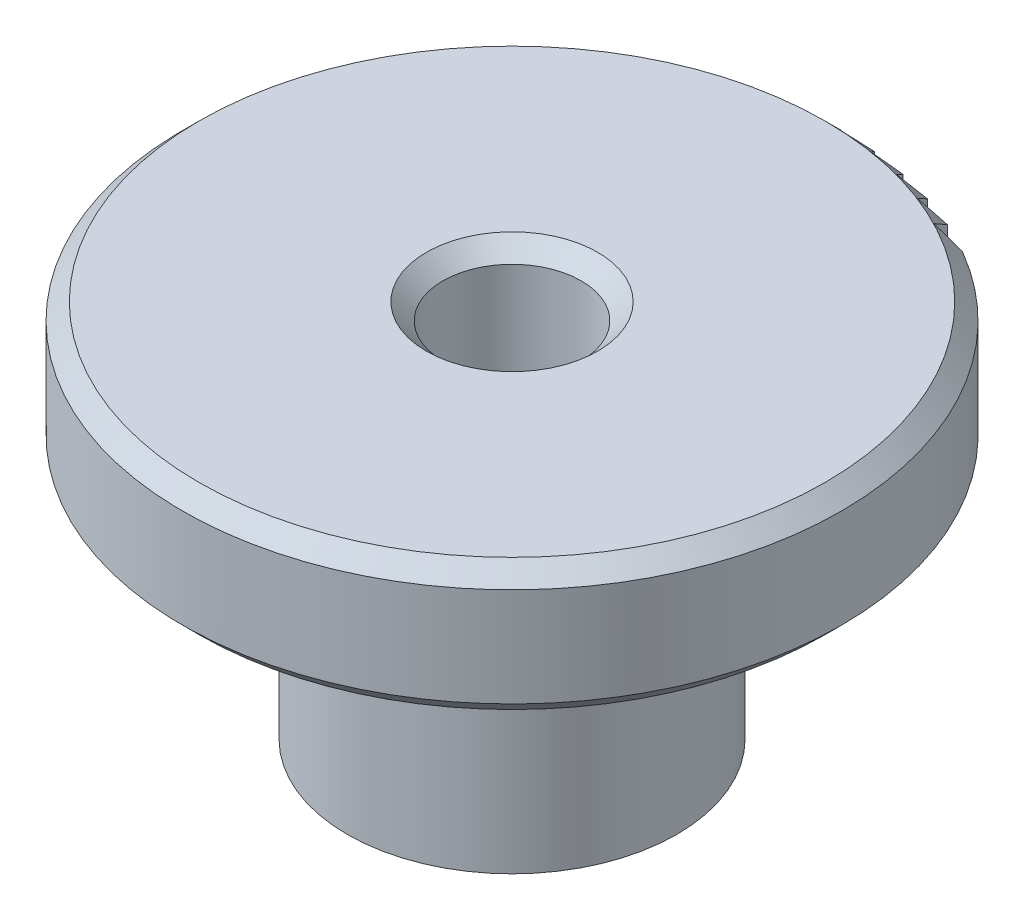
ISO-10303-21;
HEADER;
FILE_DESCRIPTION(('STEP AP214'),'2;1');
FILE_NAME('part.step','',(''),(''),'','','');
FILE_SCHEMA(('AUTOMOTIVE_DESIGN { 1 0 10303 214 1 1 1 1 }'));
ENDSEC;
DATA;
#1=APPLICATION_CONTEXT('core data for automotive mechanical design processes');
#2=APPLICATION_PROTOCOL_DEFINITION('international standard','automotive_design',2000,#1);
#3=PRODUCT_CONTEXT('',#1,'mechanical');
#4=PRODUCT('Part','Part','',(#3));
#5=PRODUCT_RELATED_PRODUCT_CATEGORY('part','',(#4));
#6=PRODUCT_DEFINITION_FORMATION('','',#4);
#7=PRODUCT_DEFINITION_CONTEXT('part definition',#1,'design');
#8=PRODUCT_DEFINITION('design','',#6,#7);
#9=PRODUCT_DEFINITION_SHAPE('','',#8);
#10=(LENGTH_UNIT() NAMED_UNIT(*) SI_UNIT(.MILLI.,.METRE.));
#11=(NAMED_UNIT(*) PLANE_ANGLE_UNIT() SI_UNIT($,.RADIAN.));
#12=(NAMED_UNIT(*) SI_UNIT($,.STERADIAN.) SOLID_ANGLE_UNIT());
#13=UNCERTAINTY_MEASURE_WITH_UNIT(LENGTH_MEASURE(1.E-05),#10,'distance_accuracy_value','');
#14=(GEOMETRIC_REPRESENTATION_CONTEXT(3) GLOBAL_UNCERTAINTY_ASSIGNED_CONTEXT((#13)) GLOBAL_UNIT_ASSIGNED_CONTEXT((#10,
#11,#12)) REPRESENTATION_CONTEXT('',''));
#15=CARTESIAN_POINT('',(0.,0.,0.));
#16=DIRECTION('',(0.,0.,1.));
#17=DIRECTION('',(1.,0.,0.));
#18=AXIS2_PLACEMENT_3D('',#15,#16,#17);
#19=CARTESIAN_POINT('',(2.08861025901959,11.5096828178469,-9.77945331733416));
#20=DIRECTION('',(0.839144434050676,0.,-0.543908649316933));
#21=DIRECTION('',(-0.543908649316933,0.,-0.839144434050676));
#22=AXIS2_PLACEMENT_3D('',#19,#20,#21);
#23=PLANE('',#22);
#24=CARTESIAN_POINT('',(2.08822562916325,10.9995000003492,-9.78004672717007));
#25=CARTESIAN_POINT('',(2.11996732636551,11.0407633619279,-9.73107550922688));
#26=CARTESIAN_POINT('',(2.15177444007028,11.0818568651845,-9.68200336695232));
#27=CARTESIAN_POINT('',(2.21552387483257,11.1636825526764,-9.58365048441301));
#28=CARTESIAN_POINT('',(2.24746619019291,11.2044147519168,-9.53436975293788));
#29=CARTESIAN_POINT('',(2.31149315108677,11.2854998031274,-9.43558870231537));
#30=CARTESIAN_POINT('',(2.34357779706658,11.3258526539069,-9.38608838247945));
#31=CARTESIAN_POINT('',(2.40789673133798,11.4061584851155,-9.28685687405201));
#32=CARTESIAN_POINT('',(2.44013102581846,11.4461114487873,-9.23712567591225));
#33=CARTESIAN_POINT('',(2.47244251184506,11.4858525868053,-9.18727538640381));
#34=B_SPLINE_CURVE_WITH_KNOTS('',3,(#24,#25,#26,#27,#28,#29,#30,#31,#32,#33),.UNSPECIFIED.,.F.,
.F.,(4,2,2,2,4),(0.,0.21441870306274,0.428828459064025,0.64323888782431,0.857658264196726),.UNSPECIFIED.);
#35=CARTESIAN_POINT('',(2.08771837433842,10.9999125497497,-9.78006557516729));
#36=VERTEX_POINT('',#35);
#37=CARTESIAN_POINT('',(2.47244251184506,11.4858525868053,-9.18727538640381));
#38=VERTEX_POINT('',#37);
#39=EDGE_CURVE('E104',#36,#38,#34,.T.);
#40=ORIENTED_EDGE('',*,*,#39,.T.);
#41=DIRECTION('',(0.,1.,0.));
#42=VECTOR('',#41,1.);
#43=CARTESIAN_POINT('',(2.47244251184506,11.5096828178469,-9.18727538640381));
#44=LINE('',#43,#42);
#45=CARTESIAN_POINT('',(2.47244251175848,7.5141474133012,-9.18727538653738));
#46=VERTEX_POINT('',#45);
#47=EDGE_CURVE('E360',#46,#38,#44,.T.);
#48=ORIENTED_EDGE('',*,*,#47,.F.);
#49=CARTESIAN_POINT('',(2.47244251160826,7.51414741345168,-9.18727538659462));
#50=CARTESIAN_POINT('',(2.44013102565015,7.55388855141539,-9.23712567614665));
#51=CARTESIAN_POINT('',(2.40789673119397,7.59384151506362,-9.2868568742761));
#52=CARTESIAN_POINT('',(2.34357779695006,7.67414734623919,-9.3860883826573));
#53=CARTESIAN_POINT('',(2.31149315097345,7.71450019700915,-9.43558870245729));
#54=CARTESIAN_POINT('',(2.24746619013146,7.79558524816792,-9.53436975306558));
#55=CARTESIAN_POINT('',(2.21552387481981,7.83631744736604,-9.5836504845624));
#56=CARTESIAN_POINT('',(2.15177443999225,7.91814313488957,-9.682003366943));
#57=CARTESIAN_POINT('',(2.11996732617353,7.95923663822021,-9.73107550903714));
#58=CARTESIAN_POINT('',(2.08822562867205,8.00050000000559,-9.78004672656881));
#59=B_SPLINE_CURVE_WITH_KNOTS('',3,(#49,#50,#51,#52,#53,#54,#55,#56,#57,#58),.UNSPECIFIED.,.F.,
.F.,(4,2,2,2,4),(0.,0.214419376278975,0.428829804944279,0.643239560852335,0.857658263823296),.UNSPECIFIED.);
#60=CARTESIAN_POINT('',(2.08771837433842,8.0000874502503,-9.78006557516729));
#61=VERTEX_POINT('',#60);
#62=EDGE_CURVE('E113',#46,#61,#59,.T.);
#63=ORIENTED_EDGE('',*,*,#62,.T.);
#64=DIRECTION('',(0.,-1.,0.));
#65=VECTOR('',#64,1.);
#66=CARTESIAN_POINT('',(2.08784101756704,11.5096828178469,-9.78064010611599));
#67=LINE('',#66,#65);
#68=EDGE_CURVE('E289',#36,#61,#67,.T.);
#69=ORIENTED_EDGE('',*,*,#68,.F.);
#70=EDGE_LOOP('',(#40,#48,#63,#69));
#71=FACE_BOUND('',#70,.T.);
#72=ADVANCED_FACE('F18',(#71),#23,.T.);
#73=CARTESIAN_POINT('',(1.49447629785486,11.5096828178469,-9.39603861183797));
#74=DIRECTION('',(-0.543908649316935,0.,-0.839144434050675));
#75=DIRECTION('',(-0.839144434050675,0.,0.543908649316935));
#76=AXIS2_PLACEMENT_3D('',#73,#74,#75);
#77=PLANE('',#76);
#78=CARTESIAN_POINT('',(1.49447629785486,11.4858525868053,-9.39603861183797));
#79=CARTESIAN_POINT('',(1.54432658738005,11.4461114487971,-9.42835009785096));
#80=CARTESIAN_POINT('',(1.59405778551122,11.4061584851206,-9.4605843923381));
#81=CARTESIAN_POINT('',(1.69328929392117,11.3258526539028,-9.52490332662263));
#82=CARTESIAN_POINT('',(1.74278961374818,11.2854998031188,-9.55698797260891));
#83=CARTESIAN_POINT('',(1.84157066440402,11.204414751928,-9.62101493347544));
#84=CARTESIAN_POINT('',(1.89085139592137,11.1636825527118,-9.65295724880197));
#85=CARTESIAN_POINT('',(1.98920427834279,11.0818568651518,-9.71670668365912));
#86=CARTESIAN_POINT('',(2.03827642045723,11.0407633618028,-9.74851379749257));
#87=CARTESIAN_POINT('',(2.08724763801229,10.9995000000008,-9.78025549500608));
#88=B_SPLINE_CURVE_WITH_KNOTS('',3,(#78,#79,#80,#81,#82,#83,#84,#85,#86,#87),.UNSPECIFIED.,.F.,
.F.,(4,2,2,2,4),(0.,0.214419376371797,0.42882980513009,0.643239561131397,0.857658264195454),.UNSPECIFIED.);
#89=CARTESIAN_POINT('',(1.49447629785486,11.4858525868053,-9.39603861183797));
#90=VERTEX_POINT('',#89);
#91=EDGE_CURVE('E442',#90,#36,#88,.T.);
#92=ORIENTED_EDGE('',*,*,#91,.T.);
#93=ORIENTED_EDGE('',*,*,#68,.T.);
#94=CARTESIAN_POINT('',(2.08724763801229,8.00049999999922,-9.78025549500608));
#95=CARTESIAN_POINT('',(2.03827642047918,7.95923663821565,-9.7485137975068));
#96=CARTESIAN_POINT('',(1.98920427838678,7.91814313488499,-9.71670668368764));
#97=CARTESIAN_POINT('',(1.89085139600963,7.83631744736139,-9.65295724885918));
#98=CARTESIAN_POINT('',(1.84157066451451,7.79558524816321,-9.62101493354705));
#99=CARTESIAN_POINT('',(1.74278961390333,7.71450019700802,-9.55698797270947));
#100=CARTESIAN_POINT('',(1.69328929409875,7.67414734624169,-9.52490332673774));
#101=CARTESIAN_POINT('',(1.59405778573389,7.5938415150588,-9.46058439248243));
#102=CARTESIAN_POINT('',(1.54432658762538,7.55388855139959,-9.42835009800997));
#103=CARTESIAN_POINT('',(1.49447629812296,7.51414741340844,-9.39603861201175));
#104=B_SPLINE_CURVE_WITH_KNOTS('',3,(#94,#95,#96,#97,#98,#99,#100,#101,#102,#103),.UNSPECIFIED.,
.F.,.F.,(4,2,2,2,4),(0.,0.214418702967953,0.428828458873172,0.643238887535376,
0.857658263811069),.UNSPECIFIED.);
#105=CARTESIAN_POINT('',(1.49447629788831,7.51414741340769,-9.3960386120483));
#106=VERTEX_POINT('',#105);
#107=EDGE_CURVE('E443',#61,#106,#104,.T.);
#108=ORIENTED_EDGE('',*,*,#107,.T.);
#109=DIRECTION('',(0.,1.,0.));
#110=VECTOR('',#109,1.);
#111=CARTESIAN_POINT('',(1.49447629785486,11.5096828178469,-9.39603861183797));
#112=LINE('',#111,#110);
#113=EDGE_CURVE('E358',#90,#106,#112,.F.);
#114=ORIENTED_EDGE('',*,*,#113,.F.);
#115=EDGE_LOOP('',(#92,#93,#108,#114));
#116=FACE_BOUND('',#115,.T.);
#117=ADVANCED_FACE('F279',(#116),#77,.T.);
#118=CARTESIAN_POINT('',(2.47244251184506,11.5096828178469,-9.18727538640381));
#119=DIRECTION('',(-0.452826495277541,0.,-0.891598657005863));
#120=DIRECTION('',(-0.891598657005863,0.,0.452826495277541));
#121=AXIS2_PLACEMENT_3D('',#118,#119,#120);
#122=PLANE('',#121);
#123=CARTESIAN_POINT('',(2.47244251184506,11.4858525868053,-9.18727538640381));
#124=CARTESIAN_POINT('',(2.52540890164524,11.4461114487966,-9.21417603780369));
#125=CARTESIAN_POINT('',(2.57824875574709,11.4061584851196,-9.24101242405877));
#126=CARTESIAN_POINT('',(2.68368314349012,11.3258526539007,-9.29456060283659));
#127=CARTESIAN_POINT('',(2.73627768727641,11.2854998031162,-9.32127240051183));
#128=CARTESIAN_POINT('',(2.84123345952453,11.2044147519243,-9.37457749931702));
#129=CARTESIAN_POINT('',(2.89359468871793,11.1636825527076,-9.40117080081849));
#130=CARTESIAN_POINT('',(2.99809552829021,11.0818568651466,-9.45424484771757));
#131=CARTESIAN_POINT('',(3.05023512933003,11.040763361797,-9.48072558837202));
#132=CARTESIAN_POINT('',(3.10226749709993,10.9994999999944,-9.50715186722865));
#133=B_SPLINE_CURVE_WITH_KNOTS('',3,(#123,#124,#125,#126,#127,#128,#129,#130,#131,#132),
.UNSPECIFIED.,.F.,.F.,(4,2,2,2,4),(0.,0.214419376374555,0.428829805135611,0.643239561139679,
0.857658264206495),.UNSPECIFIED.);
#134=CARTESIAN_POINT('',(3.10271569896085,10.9999125497497,-9.50691358730815));
#135=VERTEX_POINT('',#134);
#136=EDGE_CURVE('E271',#38,#135,#133,.T.);
#137=ORIENTED_EDGE('',*,*,#136,.T.);
#138=DIRECTION('',(0.,1.,0.));
#139=VECTOR('',#138,1.);
#140=CARTESIAN_POINT('',(3.10289796831072,11.5096828178469,-9.5074720719155));
#141=LINE('',#140,#139);
#142=CARTESIAN_POINT('',(3.10271569896085,8.0000874502503,-9.50691358730815));
#143=VERTEX_POINT('',#142);
#144=EDGE_CURVE('E428',#143,#135,#141,.T.);
#145=ORIENTED_EDGE('',*,*,#144,.F.);
#146=CARTESIAN_POINT('',(3.10226749697684,8.00049999965075,-9.50715186799523));
#147=CARTESIAN_POINT('',(3.05023512930534,7.95923663809054,-9.48072558865887));
#148=CARTESIAN_POINT('',(2.99809552832052,7.91814313485228,-9.45424484781356));
#149=CARTESIAN_POINT('',(2.89359468881949,7.83631744739681,-9.40117080078948));
#150=CARTESIAN_POINT('',(2.84123345964233,7.79558524817438,-9.37457749935382));
#151=CARTESIAN_POINT('',(2.73627768743608,7.71450019699941,-9.32127240061596));
#152=CARTESIAN_POINT('',(2.68368314367543,7.67414734623756,-9.29456060294222));
#153=CARTESIAN_POINT('',(2.57824875598424,7.59384151506388,-9.2410124241677));
#154=CARTESIAN_POINT('',(2.5254089019086,7.5538885514094,-9.21417603791442));
#155=CARTESIAN_POINT('',(2.47244251212992,7.51414741340844,-9.18727538654849));
#156=B_SPLINE_CURVE_WITH_KNOTS('',3,(#146,#147,#148,#149,#150,#151,#152,#153,#154,#155),
.UNSPECIFIED.,.F.,.F.,(4,2,2,2,4),(0.,0.214418702966636,0.428828458871829,0.643238887536023,
0.857658263812333),.UNSPECIFIED.);
#157=EDGE_CURVE('E273',#143,#46,#156,.T.);
#158=ORIENTED_EDGE('',*,*,#157,.T.);
#159=ORIENTED_EDGE('',*,*,#47,.T.);
#160=EDGE_LOOP('',(#137,#145,#158,#159));
#161=FACE_BOUND('',#160,.T.);
#162=ADVANCED_FACE('F275',(#161),#122,.T.);
#163=CARTESIAN_POINT('',(1.05060840239833,11.5096828178469,-9.94465796218302));
#164=DIRECTION('',(0.777419843274586,0.,-0.628982024610336));
#165=DIRECTION('',(-0.628982024610336,0.,-0.777419843274586));
#166=AXIS2_PLACEMENT_3D('',#163,#164,#165);
#167=PLANE('',#166);
#168=CARTESIAN_POINT('',(1.05016361200263,10.9995000003492,-9.94520772291609));
#169=CARTESIAN_POINT('',(1.08687006453926,11.0407633619279,-9.89983865999548));
#170=CARTESIAN_POINT('',(1.12365216539506,11.0818568651845,-9.85437609642634));
#171=CARTESIAN_POINT('',(1.19737272234886,11.1636825526764,-9.76325771508249));
#172=CARTESIAN_POINT('',(1.23431117185859,11.2044147519168,-9.71760190545086));
#173=CARTESIAN_POINT('',(1.30835266308866,11.2854998031274,-9.62608685062478));
#174=CARTESIAN_POINT('',(1.34545570532509,11.3258526539069,-9.58022760479245));
#175=CARTESIAN_POINT('',(1.41983483783524,11.4061584851155,-9.48829522628721));
#176=CARTESIAN_POINT('',(1.45711093526585,11.4461114487873,-9.44222208476839));
#177=CARTESIAN_POINT('',(1.49447629785486,11.4858525868053,-9.39603861183797));
#178=B_SPLINE_CURVE_WITH_KNOTS('',3,(#168,#169,#170,#171,#172,#173,#174,#175,#176,#177),
.UNSPECIFIED.,.F.,.F.,(4,2,2,2,4),(0.,0.214418703062742,0.428828459064025,0.643238887824312,
0.857658264196729),.UNSPECIFIED.);
#179=CARTESIAN_POINT('',(1.04965718079041,10.9999125497497,-9.94517322463203));
#180=VERTEX_POINT('',#179);
#181=EDGE_CURVE('E349',#180,#90,#178,.T.);
#182=ORIENTED_EDGE('',*,*,#181,.T.);
#183=ORIENTED_EDGE('',*,*,#113,.T.);
#184=CARTESIAN_POINT('',(1.49447629759934,7.51414741345169,-9.39603861200288));
#185=CARTESIAN_POINT('',(1.45711093507387,7.55388855141539,-9.44222208498383));
#186=CARTESIAN_POINT('',(1.4198348376685,7.59384151506363,-9.48829522649495));
#187=CARTESIAN_POINT('',(1.34545570519054,7.67414734623919,-9.5802276049571));
#188=CARTESIAN_POINT('',(1.30835266296107,7.71450019700915,-9.62608685075402));
#189=CARTESIAN_POINT('',(1.23431117178408,7.79558524816792,-9.7176019055714));
#190=CARTESIAN_POINT('',(1.19737272232049,7.83631744736604,-9.76325771522972));
#191=CARTESIAN_POINT('',(1.12365216531843,7.91814313488957,-9.85437609640888));
#192=CARTESIAN_POINT('',(1.08687006436826,7.95923663822021,-9.89983865978663));
#193=CARTESIAN_POINT('',(1.05016361157725,8.00050000000559,-9.9452077222666));
#194=B_SPLINE_CURVE_WITH_KNOTS('',3,(#184,#185,#186,#187,#188,#189,#190,#191,#192,#193),
.UNSPECIFIED.,.F.,.F.,(4,2,2,2,4),(0.,0.214419376278976,0.42882980494428,0.643239560852335,
0.857658263823299),.UNSPECIFIED.);
#195=CARTESIAN_POINT('',(1.04965718079041,8.00008745025031,-9.94517322463203));
#196=VERTEX_POINT('',#195);
#197=EDGE_CURVE('E346',#106,#196,#194,.T.);
#198=ORIENTED_EDGE('',*,*,#197,.T.);
#199=DIRECTION('',(0.,-1.,0.));
#200=VECTOR('',#199,1.);
#201=CARTESIAN_POINT('',(1.04971884300844,11.5096828178469,-9.94575745484642));
#202=LINE('',#201,#200);
#203=EDGE_CURVE('E411',#180,#196,#202,.T.);
#204=ORIENTED_EDGE('',*,*,#203,.F.);
#205=EDGE_LOOP('',(#182,#183,#198,#204));
#206=FACE_BOUND('',#205,.T.);
#207=ADVANCED_FACE('F278',(#206),#167,.T.);
#208=CARTESIAN_POINT('',(3.10353839370462,11.5096828178469,-9.50621109795071));
#209=DIRECTION('',(0.891598657005863,0.,-0.452826495277542));
#210=DIRECTION('',(-0.452826495277542,0.,-0.891598657005863));
#211=AXIS2_PLACEMENT_3D('',#208,#209,#210);
#212=PLANE('',#211);
#213=CARTESIAN_POINT('',(3.10321817354916,10.9995000003492,-9.50684160125108));
#214=CARTESIAN_POINT('',(3.12964445205519,11.0407633619279,-9.45480923312854));
#215=CARTESIAN_POINT('',(3.15612519256454,11.0818568651845,-9.40266963194364));
#216=CARTESIAN_POINT('',(3.20919923935623,11.1636825526764,-9.2981687922654));
#217=CARTESIAN_POINT('',(3.23579254089541,11.2044147519168,-9.24580756311111));
#218=CARTESIAN_POINT('',(3.2890976397306,11.2854998031274,-9.1408517908946));
#219=CARTESIAN_POINT('',(3.31580943739814,11.3258526539069,-9.08825724710082));
#220=CARTESIAN_POINT('',(3.36935761616038,11.4061584851155,-8.98282285934312));
#221=CARTESIAN_POINT('',(3.39619400240757,11.4461114487873,-8.92998300523411));
#222=CARTESIAN_POINT('',(3.42309465382241,11.4858525868053,-8.87701661544984));
#223=B_SPLINE_CURVE_WITH_KNOTS('',3,(#213,#214,#215,#216,#217,#218,#219,#220,#221,#222),
.UNSPECIFIED.,.F.,.F.,(4,2,2,2,4),(0.,0.214418703062738,0.42882845906402,0.643238887824305,
0.857658264196718),.UNSPECIFIED.);
#224=CARTESIAN_POINT('',(3.42309465382241,11.4858525868053,-8.87701661544983));
#225=VERTEX_POINT('',#224);
#226=EDGE_CURVE('E426',#135,#225,#223,.T.);
#227=ORIENTED_EDGE('',*,*,#226,.T.);
#228=DIRECTION('',(0.,1.,0.));
#229=VECTOR('',#228,1.);
#230=CARTESIAN_POINT('',(3.42309465382241,11.5096828178469,-8.87701661544983));
#231=LINE('',#230,#229);
#232=CARTESIAN_POINT('',(3.42309465375033,7.5141474133012,-8.87701661559176));
#233=VERTEX_POINT('',#232);
#234=EDGE_CURVE('E147',#233,#225,#231,.T.);
#235=ORIENTED_EDGE('',*,*,#234,.F.);
#236=CARTESIAN_POINT('',(3.42309465360694,7.51414741345169,-8.87701661566445));
#237=CARTESIAN_POINT('',(3.39619400226479,7.55388855141539,-8.92998300548489));
#238=CARTESIAN_POINT('',(3.36935761604068,7.59384151506362,-8.98282285958109));
#239=CARTESIAN_POINT('',(3.31580943730093,7.67414734623919,-9.08825724728992));
#240=CARTESIAN_POINT('',(3.2890976396328,7.71450019700915,-9.14085179104763));
#241=CARTESIAN_POINT('',(3.23579254084771,7.79558524816792,-9.24580756324455));
#242=CARTESIAN_POINT('',(3.20919923935921,7.83631744736604,-9.29816879241531));
#243=CARTESIAN_POINT('',(3.15612519248597,7.91814313488957,-9.40266963194257));
#244=CARTESIAN_POINT('',(3.12964445184436,7.95923663822021,-9.45480923295999));
#245=CARTESIAN_POINT('',(3.10321817299757,8.00050000000558,-9.50684160070471));
#246=B_SPLINE_CURVE_WITH_KNOTS('',3,(#236,#237,#238,#239,#240,#241,#242,#243,#244,#245),
.UNSPECIFIED.,.F.,.F.,(4,2,2,2,4),(0.,0.214419376278971,0.428829804944273,0.643239560852324,
0.857658263823286),.UNSPECIFIED.);
#247=EDGE_CURVE('E431',#233,#143,#246,.T.);
#248=ORIENTED_EDGE('',*,*,#247,.T.);
#249=ORIENTED_EDGE('',*,*,#144,.T.);
#250=EDGE_LOOP('',(#227,#235,#248,#249));
#251=FACE_BOUND('',#250,.T.);
#252=ADVANCED_FACE('F450',(#251),#212,.T.);
#253=CARTESIAN_POINT('',(0.5,11.5096828178469,-9.501));
#254=DIRECTION('',(-0.628982024610343,0.,-0.777419843274581));
#255=DIRECTION('',(-0.777419843274581,0.,0.628982024610343));
#256=AXIS2_PLACEMENT_3D('',#253,#254,#255);
#257=PLANE('',#256);
#258=CARTESIAN_POINT('',(0.5,11.4858525868053,-9.501));
#259=CARTESIAN_POINT('',(0.546183472948499,11.4461114487971,-9.53836536257723));
#260=CARTESIAN_POINT('',(0.592256614458076,11.4061584851206,-9.57564146001357));
#261=CARTESIAN_POINT('',(0.68418899294455,11.3258526539028,-9.65002059253495));
#262=CARTESIAN_POINT('',(0.730048238767345,11.2854998031188,-9.68712363477687));
#263=CARTESIAN_POINT('',(0.821563293629435,11.204414751928,-9.76116512598325));
#264=CARTESIAN_POINT('',(0.867219103306603,11.1636825527118,-9.7981035754638));
#265=CARTESIAN_POINT('',(0.958337484523256,11.0818568651518,-9.87182413249957));
#266=CARTESIAN_POINT('',(1.00380004791964,11.0407633618028,-9.90860623346652));
#267=CARTESIAN_POINT('',(1.04916911042161,10.9995000000008,-9.94531268627195));
#268=B_SPLINE_CURVE_WITH_KNOTS('',3,(#258,#259,#260,#261,#262,#263,#264,#265,#266,#267),
.UNSPECIFIED.,.F.,.F.,(4,2,2,2,4),(0.,0.214419376371798,0.428829805130094,0.643239561131402,
0.85765826419546),.UNSPECIFIED.);
#269=CARTESIAN_POINT('',(0.5,11.4858525868053,-9.501));
#270=VERTEX_POINT('',#269);
#271=EDGE_CURVE('E415',#270,#180,#268,.T.);
#272=ORIENTED_EDGE('',*,*,#271,.T.);
#273=ORIENTED_EDGE('',*,*,#203,.T.);
#274=CARTESIAN_POINT('',(1.0491691101482,8.00049999965076,-9.9453126870016));
#275=CARTESIAN_POINT('',(1.00380004784204,7.95923663809054,-9.9086062337471));
#276=CARTESIAN_POINT('',(0.958337484538716,7.91814313485228,-9.87182413260452));
#277=CARTESIAN_POINT('',(0.867219103416682,7.83631744739682,-9.79810357546042));
#278=CARTESIAN_POINT('',(0.821563293741075,7.79558524817439,-9.76116512604717));
#279=CARTESIAN_POINT('',(0.730048238904715,7.71450019699942,-9.68712363491442));
#280=CARTESIAN_POINT('',(0.684188993106087,7.67414734623756,-9.65002059267885));
#281=CARTESIAN_POINT('',(0.592256614668446,7.59384151506388,-9.57564146017057));
#282=CARTESIAN_POINT('',(0.546183473183534,7.5538885514094,-9.53836536274097));
#283=CARTESIAN_POINT('',(0.500000000248382,7.51414741340844,-9.50100000020096));
#284=B_SPLINE_CURVE_WITH_KNOTS('',3,(#274,#275,#276,#277,#278,#279,#280,#281,#282,#283),
.UNSPECIFIED.,.F.,.F.,(4,2,2,2,4),(0.,0.214418702966638,0.428828458871832,0.643238887536028,
0.85765826381234),.UNSPECIFIED.);
#285=CARTESIAN_POINT('',(0.500000000011193,7.51414741340769,-9.50100000021267));
#286=VERTEX_POINT('',#285);
#287=EDGE_CURVE('E421',#196,#286,#284,.T.);
#288=ORIENTED_EDGE('',*,*,#287,.T.);
#289=DIRECTION('',(0.,1.,0.));
#290=VECTOR('',#289,1.);
#291=CARTESIAN_POINT('',(0.5,11.5096828178469,-9.501));
#292=LINE('',#291,#290);
#293=EDGE_CURVE('E172',#270,#286,#292,.F.);
#294=ORIENTED_EDGE('',*,*,#293,.F.);
#295=EDGE_LOOP('',(#272,#273,#288,#294));
#296=FACE_BOUND('',#295,.T.);
#297=ADVANCED_FACE('F452',(#296),#257,.T.);
#298=CARTESIAN_POINT('',(0.,7.49999999999999,0.));
#299=DIRECTION('',(0.,1.,0.));
#300=DIRECTION('',(0.,0.,1.));
#301=AXIS2_PLACEMENT_3D('',#298,#299,#300);
#302=CYLINDRICAL_SURFACE('',#301,5.);
#303=CARTESIAN_POINT('',(0.,7.49999999999999,0.));
#304=DIRECTION('',(0.,1.,0.));
#305=DIRECTION('',(0.,0.,1.));
#306=AXIS2_PLACEMENT_3D('',#303,#304,#305);
#307=CIRCLE('',#306,5.);
#308=CARTESIAN_POINT('',(0.,7.49999999999999,5.));
#309=VERTEX_POINT('',#308);
#310=EDGE_CURVE('E165',#309,#309,#307,.T.);
#311=ORIENTED_EDGE('',*,*,#310,.F.);
#312=EDGE_LOOP('',(#311));
#313=FACE_BOUND('',#312,.T.);
#314=CARTESIAN_POINT('',(0.,0.,0.));
#315=DIRECTION('',(0.,1.,0.));
#316=DIRECTION('',(0.,0.,1.));
#317=AXIS2_PLACEMENT_3D('',#314,#315,#316);
#318=CIRCLE('',#317,5.);
#319=CARTESIAN_POINT('',(0.,0.,5.));
#320=VERTEX_POINT('',#319);
#321=EDGE_CURVE('E150',#320,#320,#318,.F.);
#322=ORIENTED_EDGE('',*,*,#321,.F.);
#323=EDGE_LOOP('',(#322));
#324=FACE_BOUND('',#323,.T.);
#325=ADVANCED_FACE('F458',(#313,#324),#302,.T.);
#326=CARTESIAN_POINT('',(3.42309465382241,11.5096828178469,-8.87701661544983));
#327=DIRECTION('',(-0.356741783871469,0.,-0.934203029132427));
#328=DIRECTION('',(-0.934203029132427,0.,0.356741783871469));
#329=AXIS2_PLACEMENT_3D('',#326,#327,#328);
#330=PLANE('',#329);
#331=CARTESIAN_POINT('',(3.42309465382241,11.4858525868053,-8.87701661544983));
#332=CARTESIAN_POINT('',(3.47859200277503,11.4461114487966,-8.89820924986452));
#333=CARTESIAN_POINT('',(3.53395676961601,11.4061584851196,-8.91935125547846));
#334=CARTESIAN_POINT('',(3.64442926038337,11.3258526539007,-8.96153711036877));
#335=CARTESIAN_POINT('',(3.69953699493961,11.2854998031162,-8.98258096370434));
#336=CARTESIAN_POINT('',(3.80950799993012,11.2044147519243,-9.02457531747013));
#337=CARTESIAN_POINT('',(3.86437127113091,11.1636825527076,-9.04552581819305));
#338=CARTESIAN_POINT('',(3.97386560482939,11.0818568651465,-9.08733814667981));
#339=CARTESIAN_POINT('',(4.02849665754175,11.040763361797,-9.10819997070695));
#340=CARTESIAN_POINT('',(4.08301535292293,10.9994999999944,-9.12901888911989));
#341=B_SPLINE_CURVE_WITH_KNOTS('',3,(#331,#332,#333,#334,#335,#336,#337,#338,#339,#340),
.UNSPECIFIED.,.F.,.F.,(4,2,2,2,4),(0.,0.214419376374558,0.428829805135614,0.643239561139683,
0.857658264206501),.UNSPECIFIED.);
#342=CARTESIAN_POINT('',(4.08343606885904,10.9999125497497,-9.1287348814972));
#343=VERTEX_POINT('',#342);
#344=EDGE_CURVE('E139',#225,#343,#341,.T.);
#345=ORIENTED_EDGE('',*,*,#344,.T.);
#346=DIRECTION('',(0.,1.,0.));
#347=VECTOR('',#346,1.);
#348=CARTESIAN_POINT('',(4.08367595072697,11.5096828178469,-9.12927114995794));
#349=LINE('',#348,#347);
#350=CARTESIAN_POINT('',(4.08340328386282,8.00004101797638,-9.1287283657055));
#351=VERTEX_POINT('',#350);
#352=EDGE_CURVE('E144',#351,#343,#349,.T.);
#353=ORIENTED_EDGE('',*,*,#352,.F.);
#354=CARTESIAN_POINT('',(4.08297438177218,8.0004689901671,-9.1290032435686));
#355=CARTESIAN_POINT('',(4.02845904451306,7.95920829793589,-9.10818560751337));
#356=CARTESIAN_POINT('',(3.97383136281709,7.91811744521851,-9.08732507076786));
#357=CARTESIAN_POINT('',(3.86434379831041,7.83629701723923,-9.04551532721551));
#358=CARTESIAN_POINT('',(3.80948392528278,7.79556742697552,-9.02456612414451));
#359=CARTESIAN_POINT('',(3.69951974600196,7.71448754884557,-8.98257437689549));
#360=CARTESIAN_POINT('',(3.64441543898248,7.67413726216968,-8.96153183242484));
#361=CARTESIAN_POINT('',(3.53394983494114,7.59383651056269,-8.91934860735144));
#362=CARTESIAN_POINT('',(3.47858852729191,7.55388606238504,-8.89820792269043));
#363=CARTESIAN_POINT('',(3.42309465412089,7.51414741340845,-8.87701661556381));
#364=B_SPLINE_CURVE_WITH_KNOTS('',3,(#354,#355,#356,#357,#358,#359,#360,#361,#362,#363),
.UNSPECIFIED.,.F.,.F.,(4,2,2,2,4),(0.,0.214405274216124,0.428801602939416,0.643198604260089,
0.857604551624149),.UNSPECIFIED.);
#365=EDGE_CURVE('E408',#351,#233,#364,.T.);
#366=ORIENTED_EDGE('',*,*,#365,.T.);
#367=ORIENTED_EDGE('',*,*,#234,.T.);
#368=EDGE_LOOP('',(#345,#353,#366,#367));
#369=FACE_BOUND('',#368,.T.);
#370=ADVANCED_FACE('F141',(#369),#330,.T.);
#371=CARTESIAN_POINT('',(5.,0.,5.06000210822354));
#372=DIRECTION('',(0.,-1.,0.));
#373=DIRECTION('',(0.,0.,-1.));
#374=AXIS2_PLACEMENT_3D('',#371,#372,#373);
#375=PLANE('',#374);
#376=ORIENTED_EDGE('',*,*,#321,.T.);
#377=EDGE_LOOP('',(#376));
#378=FACE_BOUND('',#377,.T.);
#379=CARTESIAN_POINT('',(0.,-5.6843418860808E-11,0.));
#380=DIRECTION('',(0.,-1.,0.));
#381=DIRECTION('',(0.,0.,-1.));
#382=AXIS2_PLACEMENT_3D('',#379,#380,#381);
#383=CIRCLE('',#382,2.59999999997262);
#384=CARTESIAN_POINT('',(0.,-5.6843418860808E-11,-2.59999999997262));
#385=VERTEX_POINT('',#384);
#386=EDGE_CURVE('E160',#385,#385,#383,.F.);
#387=ORIENTED_EDGE('',*,*,#386,.T.);
#388=EDGE_LOOP('',(#387));
#389=FACE_BOUND('',#388,.T.);
#390=ADVANCED_FACE('F524',(#378,#389),#375,.T.);
#391=CARTESIAN_POINT('',(0.001000050005,11.5096828178469,-9.999999949995));
#392=DIRECTION('',(0.707106781186549,0.,-0.707106781186546));
#393=DIRECTION('',(-0.707106781186546,0.,-0.707106781186549));
#394=AXIS2_PLACEMENT_3D('',#391,#392,#393);
#395=PLANE('',#394);
#396=CARTESIAN_POINT('',(0.00100005000500337,11.,-9.999999949995));
#397=CARTESIAN_POINT('',(0.0422247624825516,11.041220318649,-9.95877523751745));
#398=CARTESIAN_POINT('',(0.0835343619346512,11.082271084126,-9.91746563806535));
#399=CARTESIAN_POINT('',(0.166329005199092,11.1640119677914,-9.83467099480091));
#400=CARTESIAN_POINT('',(0.207814041632306,11.20470210093,-9.7931859583677));
#401=CARTESIAN_POINT('',(0.290968792243842,11.285703742749,-9.71003120775616));
#402=CARTESIAN_POINT('',(0.332638506999594,11.3260152502444,-9.66836149300041));
#403=CARTESIAN_POINT('',(0.41617209241549,11.406239178261,-9.58482790758451));
#404=CARTESIAN_POINT('',(0.458035971090956,11.4461515820881,-9.54296402890905));
#405=CARTESIAN_POINT('',(0.499999999999999,11.4858525868053,-9.501));
#406=B_SPLINE_CURVE_WITH_KNOTS('',3,(#396,#397,#398,#399,#400,#401,#402,#403,#404,#405),
.UNSPECIFIED.,.F.,.F.,(4,2,2,2,4),(0.,0.21420217558879,0.428395429407413,0.642589353412843,
0.856792199736009),.UNSPECIFIED.);
#407=CARTESIAN_POINT('',(0.00100005000500041,11.,-9.999999949995));
#408=VERTEX_POINT('',#407);
#409=EDGE_CURVE('E184',#408,#270,#406,.T.);
#410=ORIENTED_EDGE('',*,*,#409,.T.);
#411=ORIENTED_EDGE('',*,*,#293,.T.);
#412=CARTESIAN_POINT('',(0.499999999728582,7.51414741345169,-9.50100000013718));
#413=CARTESIAN_POINT('',(0.458035970868138,7.55384841812382,-9.54296402908339));
#414=CARTESIAN_POINT('',(0.41617209222385,7.59376082192224,-9.5848279077631));
#415=CARTESIAN_POINT('',(0.332638506854762,7.67398474989556,-9.66836149315829));
#416=CARTESIAN_POINT('',(0.290968792114639,7.71429625737642,-9.71003120788909));
#417=CARTESIAN_POINT('',(0.207814041538091,7.79529789916227,-9.79318595845818));
#418=CARTESIAN_POINT('',(0.166329005124236,7.83598803228219,-9.8346709948739));
#419=CARTESIAN_POINT('',(0.0835343618983195,7.91772891591009,-9.91746563810355));
#420=CARTESIAN_POINT('',(0.0422247624653852,7.95877968136823,-9.95877523753835));
#421=CARTESIAN_POINT('',(0.00100005000500014,7.99999999999999,-9.999999949995));
#422=B_SPLINE_CURVE_WITH_KNOTS('',3,(#412,#413,#414,#415,#416,#417,#418,#419,#420,#421),
.UNSPECIFIED.,.F.,.F.,(4,2,2,2,4),(0.,0.214202846227583,0.428396770137262,0.642590023859872,
0.856792199352806),.UNSPECIFIED.);
#423=CARTESIAN_POINT('',(0.00100005000499958,7.99999999999999,-9.999999949995));
#424=VERTEX_POINT('',#423);
#425=EDGE_CURVE('E192',#286,#424,#422,.T.);
#426=ORIENTED_EDGE('',*,*,#425,.T.);
#427=DIRECTION('',(0.,1.,0.));
#428=VECTOR('',#427,1.);
#429=CARTESIAN_POINT('',(0.00100005000499745,11.,-9.999999949995));
#430=LINE('',#429,#428);
#431=EDGE_CURVE('E398',#408,#424,#430,.F.);
#432=ORIENTED_EDGE('',*,*,#431,.F.);
#433=EDGE_LOOP('',(#410,#411,#426,#432));
#434=FACE_BOUND('',#433,.T.);
#435=ADVANCED_FACE('F197',(#434),#395,.T.);
#436=CARTESIAN_POINT('',(9.5,7.49999999999999,9.61400210826473));
#437=DIRECTION('',(0.,-1.,0.));
#438=DIRECTION('',(0.,0.,-1.));
#439=AXIS2_PLACEMENT_3D('',#436,#437,#438);
#440=PLANE('',#439);
#441=CARTESIAN_POINT('',(0.,7.49999999999999,0.));
#442=DIRECTION('',(0.,1.,0.));
#443=DIRECTION('',(-1.,0.,0.));
#444=AXIS2_PLACEMENT_3D('',#441,#442,#443);
#445=CIRCLE('',#444,9.5);
#446=CARTESIAN_POINT('',(-9.5,7.49999999999999,0.));
#447=VERTEX_POINT('',#446);
#448=EDGE_CURVE('E401',#447,#447,#445,.T.);
#449=ORIENTED_EDGE('',*,*,#448,.F.);
#450=EDGE_LOOP('',(#449));
#451=FACE_BOUND('',#450,.T.);
#452=ORIENTED_EDGE('',*,*,#310,.T.);
#453=EDGE_LOOP('',(#452));
#454=FACE_BOUND('',#453,.T.);
#455=ADVANCED_FACE('F513',(#451,#454),#440,.T.);
#456=CARTESIAN_POINT('',(4.08418048502396,11.5096828178469,-9.12794992129939));
#457=DIRECTION('',(0.934203029132431,0.,-0.356741783871457));
#458=DIRECTION('',(-0.356741783871457,0.,-0.934203029132431));
#459=AXIS2_PLACEMENT_3D('',#456,#457,#458);
#460=PLANE('',#459);
#461=CARTESIAN_POINT('',(4.08392821217091,10.9995000003492,-9.12861055263936));
#462=CARTESIAN_POINT('',(4.10474713019817,11.0407633619279,-9.07409185694428));
#463=CARTESIAN_POINT('',(4.12560895406578,11.0818568651845,-9.01946080410288));
#464=CARTESIAN_POINT('',(4.16742128243462,11.1636825526764,-8.90996647031031));
#465=CARTESIAN_POINT('',(4.18837178319915,11.2044147519168,-8.85510319914445));
#466=CARTESIAN_POINT('',(4.23036613699809,11.2854998031274,-8.74513219418222));
#467=CARTESIAN_POINT('',(4.25140999032521,11.3258526539069,-8.69002445961933));
#468=CARTESIAN_POINT('',(4.29359584519849,11.4061584851155,-8.57955196883902));
#469=CARTESIAN_POINT('',(4.31473785080384,11.4461114487873,-8.52418720199175));
#470=CARTESIAN_POINT('',(4.33593048523506,11.4858525868053,-8.46868985305338));
#471=B_SPLINE_CURVE_WITH_KNOTS('',3,(#461,#462,#463,#464,#465,#466,#467,#468,#469,#470),
.UNSPECIFIED.,.F.,.F.,(4,2,2,2,4),(0.,0.214418703062738,0.428828459064021,0.643238887824307,
0.857658264196721),.UNSPECIFIED.);
#472=CARTESIAN_POINT('',(4.33593048523506,11.4858525868053,-8.46868985305338));
#473=VERTEX_POINT('',#472);
#474=EDGE_CURVE('E152',#343,#473,#471,.T.);
#475=ORIENTED_EDGE('',*,*,#474,.T.);
#476=DIRECTION('',(0.,1.,0.));
#477=VECTOR('',#476,1.);
#478=CARTESIAN_POINT('',(4.33593048523506,11.5096828178469,-8.46868985305338));
#479=LINE('',#478,#477);
#480=CARTESIAN_POINT('',(4.3359304757506,7.51414743098016,-8.46868987789043));
#481=VERTEX_POINT('',#480);
#482=EDGE_CURVE('E388',#481,#473,#479,.T.);
#483=ORIENTED_EDGE('',*,*,#482,.F.);
#484=CARTESIAN_POINT('',(4.08393468647675,8.00048716657161,-9.1285935962423));
#485=CARTESIAN_POINT('',(4.10475307263691,7.95922491264303,-9.07407629467639));
#486=CARTESIAN_POINT('',(4.12561436236712,7.9181325093042,-9.0194466411324));
#487=CARTESIAN_POINT('',(4.16742561795443,7.83630900445862,-8.90995511704568));
#488=CARTESIAN_POINT('',(4.18837558007521,7.79557788794806,-8.85509325628733));
#489=CARTESIAN_POINT('',(4.23036885198169,7.71449498354996,-8.74512508437184));
#490=CARTESIAN_POINT('',(4.25141216206007,7.67414319685297,-8.69001877244827));
#491=CARTESIAN_POINT('',(4.29359692541809,7.59383947362909,-8.57954914008668));
#492=CARTESIAN_POINT('',(4.31473838275653,7.55388755385792,-8.52418580901984));
#493=CARTESIAN_POINT('',(4.33593046626573,7.51414744876636,-8.46868990272854));
#494=B_SPLINE_CURVE_WITH_KNOTS('',3,(#484,#485,#486,#487,#488,#489,#490,#491,#492,#493),
.UNSPECIFIED.,.F.,.F.,(4,2,2,2,4),(0.,0.214413129580136,0.428817312749386,0.643222168609358,
0.857635971430883),.UNSPECIFIED.);
#495=EDGE_CURVE('E163',#351,#481,#494,.T.);
#496=ORIENTED_EDGE('',*,*,#495,.F.);
#497=ORIENTED_EDGE('',*,*,#352,.T.);
#498=EDGE_LOOP('',(#475,#483,#496,#497));
#499=FACE_BOUND('',#498,.T.);
#500=ADVANCED_FACE('F162',(#499),#460,.T.);
#501=CARTESIAN_POINT('',(0.,0.,0.));
#502=DIRECTION('',(0.,-1.,0.));
#503=DIRECTION('',(0.,0.,-1.));
#504=AXIS2_PLACEMENT_3D('',#501,#502,#503);
#505=CONICAL_SURFACE('',#504,2.59999999991578,0.785398163340605);
#506=CARTESIAN_POINT('',(0.,0.500000000000007,0.));
#507=DIRECTION('',(0.,-1.,0.));
#508=DIRECTION('',(0.,0.,-1.));
#509=AXIS2_PLACEMENT_3D('',#506,#507,#508);
#510=CIRCLE('',#509,2.1);
#511=CARTESIAN_POINT('',(0.,0.500000000000007,-2.1));
#512=VERTEX_POINT('',#511);
#513=EDGE_CURVE('E394',#512,#512,#510,.F.);
#514=ORIENTED_EDGE('',*,*,#513,.T.);
#515=EDGE_LOOP('',(#514));
#516=FACE_BOUND('',#515,.T.);
#517=ORIENTED_EDGE('',*,*,#386,.F.);
#518=EDGE_LOOP('',(#517));
#519=FACE_BOUND('',#518,.T.);
#520=ADVANCED_FACE('F296',(#516,#519),#505,.F.);
#521=CARTESIAN_POINT('',(0.,7.99999999999999,0.));
#522=DIRECTION('',(0.,1.,0.));
#523=DIRECTION('',(-1.,0.,0.));
#524=AXIS2_PLACEMENT_3D('',#521,#522,#523);
#525=CONICAL_SURFACE('',#524,10.,0.785398163397448);
#526=CARTESIAN_POINT('',(0.,7.99999999999999,0.));
#527=DIRECTION('',(0.,1.,0.));
#528=DIRECTION('',(0.,0.,1.));
#529=AXIS2_PLACEMENT_3D('',#526,#527,#528);
#530=CIRCLE('',#529,10.);
#531=CARTESIAN_POINT('',(5.01797302671984,7.99999999999999,-8.64985240932538));
#532=VERTEX_POINT('',#531);
#533=EDGE_CURVE('E391',#424,#532,#530,.T.);
#534=ORIENTED_EDGE('',*,*,#533,.F.);
#535=ORIENTED_EDGE('',*,*,#425,.F.);
#536=ORIENTED_EDGE('',*,*,#287,.F.);
#537=ORIENTED_EDGE('',*,*,#197,.F.);
#538=ORIENTED_EDGE('',*,*,#107,.F.);
#539=ORIENTED_EDGE('',*,*,#62,.F.);
#540=ORIENTED_EDGE('',*,*,#157,.F.);
#541=ORIENTED_EDGE('',*,*,#247,.F.);
#542=ORIENTED_EDGE('',*,*,#365,.F.);
#543=ORIENTED_EDGE('',*,*,#495,.T.);
#544=CARTESIAN_POINT('',(5.01797302671984,7.99999999999999,-8.64985240932538));
#545=CARTESIAN_POINT('',(4.96162631330556,7.95877968207529,-8.63488572613663));
#546=CARTESIAN_POINT('',(4.90516357477779,7.91772891731659,-8.61988822462662));
#547=CARTESIAN_POINT('',(4.79199829707081,7.83598803507482,-8.58982952631434));
#548=CARTESIAN_POINT('',(4.73529576797752,7.79529790264158,-8.57476833219108));
#549=CARTESIAN_POINT('',(4.62163828877564,7.71429626221915,-8.54457889646054));
#550=CARTESIAN_POINT('',(4.5646833378778,7.67398475541502,-8.52945065464364));
#551=CARTESIAN_POINT('',(4.45050806014068,7.59376082876577,-8.49912368246842));
#552=CARTESIAN_POINT('',(4.39328772234591,7.55384842561469,-8.48392494920014));
#553=CARTESIAN_POINT('',(4.33593049732851,7.51414742156539,-8.46868985626562));
#554=B_SPLINE_CURVE_WITH_KNOTS('',3,(#544,#545,#546,#547,#548,#549,#550,#551,#552,#553),
.UNSPECIFIED.,.F.,.F.,(4,2,2,2,4),(0.,0.214202171824956,0.428395421880251,0.642589342122302,
0.856792184681586),.UNSPECIFIED.);
#555=EDGE_CURVE('E309',#532,#481,#554,.T.);
#556=ORIENTED_EDGE('',*,*,#555,.F.);
#557=EDGE_LOOP('',(#534,#535,#536,#537,#538,#539,#540,#541,#542,#543,#556));
#558=FACE_BOUND('',#557,.T.);
#559=ORIENTED_EDGE('',*,*,#448,.T.);
#560=EDGE_LOOP('',(#559));
#561=FACE_BOUND('',#560,.T.);
#562=ADVANCED_FACE('F291',(#558,#561),#525,.T.);
#563=CARTESIAN_POINT('',(4.33593048523506,11.5096828178469,-8.46868985305338));
#564=DIRECTION('',(-0.25671600175171,0.,-0.96648688270696));
#565=DIRECTION('',(-0.96648688270696,0.,0.25671600175171));
#566=AXIS2_PLACEMENT_3D('',#563,#564,#565);
#567=PLANE('',#566);
#568=CARTESIAN_POINT('',(4.33593048523506,11.4858525868053,-8.46868985305338));
#569=CARTESIAN_POINT('',(4.39328771127958,11.4461515820881,-8.48392494626073));
#570=CARTESIAN_POINT('',(4.45050805009627,11.406239178261,-8.49912367980045));
#571=CARTESIAN_POINT('',(4.56468332986727,11.3260152502444,-8.5294506525159));
#572=CARTESIAN_POINT('',(4.62163828177707,11.285703742749,-8.5445788946016));
#573=CARTESIAN_POINT('',(4.73529576299364,11.20470210093,-8.57476833086727));
#574=CARTESIAN_POINT('',(4.79199829308965,11.1640119677914,-8.58982952525688));
#575=CARTESIAN_POINT('',(4.90516357279352,11.082271084126,-8.61988822409956));
#576=CARTESIAN_POINT('',(4.96162631231546,11.041220318649,-8.63488572587364));
#577=CARTESIAN_POINT('',(5.01797302671984,11.,-8.64985240932538));
#578=B_SPLINE_CURVE_WITH_KNOTS('',3,(#568,#569,#570,#571,#572,#573,#574,#575,#576,#577),
.UNSPECIFIED.,.F.,.F.,(4,2,2,2,4),(0.,0.214202846323165,0.428396770328594,0.642590024147216,
0.856792199736005),.UNSPECIFIED.);
#579=CARTESIAN_POINT('',(5.01797302671984,11.,-8.64985240932538));
#580=VERTEX_POINT('',#579);
#581=EDGE_CURVE('E46',#473,#580,#578,.T.);
#582=ORIENTED_EDGE('',*,*,#581,.T.);
#583=DIRECTION('',(0.,1.,0.));
#584=VECTOR('',#583,1.);
#585=CARTESIAN_POINT('',(5.01797302671984,11.,-8.64985240932538));
#586=LINE('',#585,#584);
#587=EDGE_CURVE('E383',#532,#580,#586,.T.);
#588=ORIENTED_EDGE('',*,*,#587,.F.);
#589=ORIENTED_EDGE('',*,*,#555,.T.);
#590=ORIENTED_EDGE('',*,*,#482,.T.);
#591=EDGE_LOOP('',(#582,#588,#589,#590));
#592=FACE_BOUND('',#591,.T.);
#593=ADVANCED_FACE('F295',(#592),#567,.T.);
#594=CARTESIAN_POINT('',(0.,11.5,0.));
#595=DIRECTION('',(0.,-1.,0.));
#596=DIRECTION('',(0.,0.,-1.));
#597=AXIS2_PLACEMENT_3D('',#594,#595,#596);
#598=CYLINDRICAL_SURFACE('',#597,2.1);
#599=CARTESIAN_POINT('',(0.,11.0000000000241,0.));
#600=DIRECTION('',(0.,1.,0.));
#601=DIRECTION('',(0.,0.,1.));
#602=AXIS2_PLACEMENT_3D('',#599,#600,#601);
#603=CIRCLE('',#602,2.09999999998445);
#604=CARTESIAN_POINT('',(0.,11.0000000000241,2.09999999998445));
#605=VERTEX_POINT('',#604);
#606=EDGE_CURVE('E380',#605,#605,#603,.T.);
#607=ORIENTED_EDGE('',*,*,#606,.T.);
#608=EDGE_LOOP('',(#607));
#609=FACE_BOUND('',#608,.T.);
#610=ORIENTED_EDGE('',*,*,#513,.F.);
#611=EDGE_LOOP('',(#610));
#612=FACE_BOUND('',#611,.T.);
#613=ADVANCED_FACE('F485',(#609,#612),#598,.F.);
#614=CARTESIAN_POINT('',(0.,11.,0.));
#615=DIRECTION('',(0.,1.,0.));
#616=DIRECTION('',(0.,0.,1.));
#617=AXIS2_PLACEMENT_3D('',#614,#615,#616);
#618=CYLINDRICAL_SURFACE('',#617,10.);
#619=ORIENTED_EDGE('',*,*,#587,.T.);
#620=CARTESIAN_POINT('',(0.,11.,0.));
#621=DIRECTION('',(0.,-1.,0.));
#622=DIRECTION('',(0.,0.,-1.));
#623=AXIS2_PLACEMENT_3D('',#620,#621,#622);
#624=CIRCLE('',#623,10.);
#625=EDGE_CURVE('E374',#408,#580,#624,.F.);
#626=ORIENTED_EDGE('',*,*,#625,.F.);
#627=ORIENTED_EDGE('',*,*,#431,.T.);
#628=ORIENTED_EDGE('',*,*,#533,.T.);
#629=EDGE_LOOP('',(#619,#626,#627,#628));
#630=FACE_BOUND('',#629,.T.);
#631=ADVANCED_FACE('F478',(#630),#618,.T.);
#632=CARTESIAN_POINT('',(0.,11.5000000000123,0.));
#633=DIRECTION('',(0.,1.,0.));
#634=DIRECTION('',(0.,0.,1.));
#635=AXIS2_PLACEMENT_3D('',#632,#633,#634);
#636=CONICAL_SURFACE('',#635,2.60000000002947,0.785398163454292);
#637=ORIENTED_EDGE('',*,*,#606,.F.);
#638=EDGE_LOOP('',(#637));
#639=FACE_BOUND('',#638,.T.);
#640=CARTESIAN_POINT('',(0.,11.5000000000123,0.));
#641=DIRECTION('',(0.,1.,0.));
#642=DIRECTION('',(0.,0.,1.));
#643=AXIS2_PLACEMENT_3D('',#640,#641,#642);
#644=CIRCLE('',#643,2.60000000002947);
#645=CARTESIAN_POINT('',(0.,11.5000000000123,2.60000000002947));
#646=VERTEX_POINT('',#645);
#647=EDGE_CURVE('E33',#646,#646,#644,.F.);
#648=ORIENTED_EDGE('',*,*,#647,.F.);
#649=EDGE_LOOP('',(#648));
#650=FACE_BOUND('',#649,.T.);
#651=ADVANCED_FACE('F206',(#639,#650),#636,.F.);
#652=CARTESIAN_POINT('',(0.,11.,0.));
#653=DIRECTION('',(0.,-1.,0.));
#654=DIRECTION('',(0.,0.,-1.));
#655=AXIS2_PLACEMENT_3D('',#652,#653,#654);
#656=CONICAL_SURFACE('',#655,10.,0.785398163397447);
#657=ORIENTED_EDGE('',*,*,#409,.F.);
#658=ORIENTED_EDGE('',*,*,#625,.T.);
#659=ORIENTED_EDGE('',*,*,#581,.F.);
#660=ORIENTED_EDGE('',*,*,#474,.F.);
#661=ORIENTED_EDGE('',*,*,#344,.F.);
#662=ORIENTED_EDGE('',*,*,#226,.F.);
#663=ORIENTED_EDGE('',*,*,#136,.F.);
#664=ORIENTED_EDGE('',*,*,#39,.F.);
#665=ORIENTED_EDGE('',*,*,#91,.F.);
#666=ORIENTED_EDGE('',*,*,#181,.F.);
#667=ORIENTED_EDGE('',*,*,#271,.F.);
#668=EDGE_LOOP('',(#657,#658,#659,#660,#661,#662,#663,#664,#665,#666,#667));
#669=FACE_BOUND('',#668,.T.);
#670=CARTESIAN_POINT('',(0.,11.5,0.));
#671=DIRECTION('',(0.,-1.,0.));
#672=DIRECTION('',(0.,0.,-1.));
#673=AXIS2_PLACEMENT_3D('',#670,#671,#672);
#674=CIRCLE('',#673,9.5);
#675=CARTESIAN_POINT('',(0.,11.5,-9.5));
#676=VERTEX_POINT('',#675);
#677=EDGE_CURVE('E11',#676,#676,#674,.F.);
#678=ORIENTED_EDGE('',*,*,#677,.F.);
#679=EDGE_LOOP('',(#678));
#680=FACE_BOUND('',#679,.T.);
#681=ADVANCED_FACE('F154',(#669,#680),#656,.T.);
#682=CARTESIAN_POINT('',(-9.5,11.5,9.61400210824937));
#683=DIRECTION('',(0.,1.,0.));
#684=DIRECTION('',(0.,0.,1.));
#685=AXIS2_PLACEMENT_3D('',#682,#683,#684);
#686=PLANE('',#685);
#687=ORIENTED_EDGE('',*,*,#677,.T.);
#688=EDGE_LOOP('',(#687));
#689=FACE_BOUND('',#688,.T.);
#690=ORIENTED_EDGE('',*,*,#647,.T.);
#691=EDGE_LOOP('',(#690));
#692=FACE_BOUND('',#691,.T.);
#693=ADVANCED_FACE('F205',(#689,#692),#686,.T.);
#694=CLOSED_SHELL('',(#72,#117,#162,#207,#252,#297,#325,#370,#390,#435,#455,#500,#520,#562,#593,
#613,#631,#651,#681,#693));
#695=MANIFOLD_SOLID_BREP('B1',#694);
#696=ADVANCED_BREP_SHAPE_REPRESENTATION('',(#18,#695),#14);
#697=SHAPE_DEFINITION_REPRESENTATION(#9,#696);
ENDSEC;
END-ISO-10303-21;
